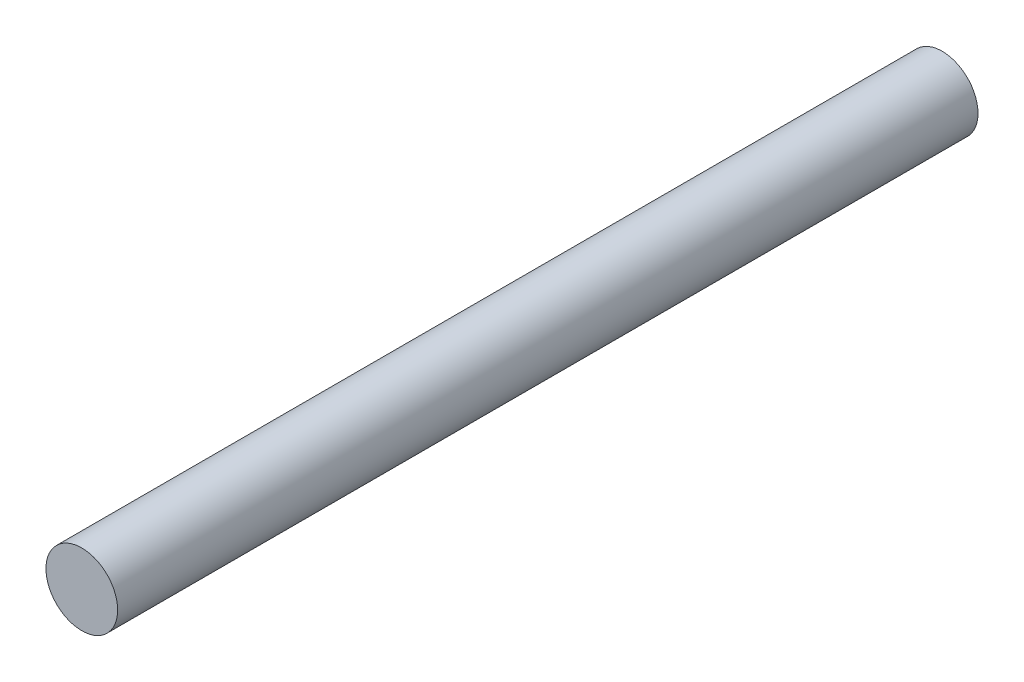
ISO-10303-21;
HEADER;
FILE_DESCRIPTION(('STEP AP214'),'2;1');
FILE_NAME('part.step','',(''),(''),'','','');
FILE_SCHEMA(('AUTOMOTIVE_DESIGN { 1 0 10303 214 1 1 1 1 }'));
ENDSEC;
DATA;
#1=APPLICATION_CONTEXT('core data for automotive mechanical design processes');
#2=APPLICATION_PROTOCOL_DEFINITION('international standard','automotive_design',2000,#1);
#3=PRODUCT_CONTEXT('',#1,'mechanical');
#4=PRODUCT('Part','Part','',(#3));
#5=PRODUCT_RELATED_PRODUCT_CATEGORY('part','',(#4));
#6=PRODUCT_DEFINITION_FORMATION('','',#4);
#7=PRODUCT_DEFINITION_CONTEXT('part definition',#1,'design');
#8=PRODUCT_DEFINITION('design','',#6,#7);
#9=PRODUCT_DEFINITION_SHAPE('','',#8);
#10=(LENGTH_UNIT() NAMED_UNIT(*) SI_UNIT(.MILLI.,.METRE.));
#11=(NAMED_UNIT(*) PLANE_ANGLE_UNIT() SI_UNIT($,.RADIAN.));
#12=(NAMED_UNIT(*) SI_UNIT($,.STERADIAN.) SOLID_ANGLE_UNIT());
#13=UNCERTAINTY_MEASURE_WITH_UNIT(LENGTH_MEASURE(1.E-05),#10,'distance_accuracy_value','');
#14=(GEOMETRIC_REPRESENTATION_CONTEXT(3) GLOBAL_UNCERTAINTY_ASSIGNED_CONTEXT((#13)) GLOBAL_UNIT_ASSIGNED_CONTEXT((#10,
#11,#12)) REPRESENTATION_CONTEXT('',''));
#15=CARTESIAN_POINT('',(0.,0.,0.));
#16=DIRECTION('',(0.,0.,1.));
#17=DIRECTION('',(1.,0.,0.));
#18=AXIS2_PLACEMENT_3D('',#15,#16,#17);
#19=CARTESIAN_POINT('',(0.,0.,60.));
#20=DIRECTION('',(0.,0.,-1.));
#21=DIRECTION('',(-1.,0.,0.));
#22=AXIS2_PLACEMENT_3D('',#19,#20,#21);
#23=CYLINDRICAL_SURFACE('',#22,2.5);
#24=CARTESIAN_POINT('',(0.,0.,60.));
#25=DIRECTION('',(0.,0.,1.));
#26=DIRECTION('',(1.,0.,0.));
#27=AXIS2_PLACEMENT_3D('',#24,#25,#26);
#28=CIRCLE('',#27,2.5);
#29=CARTESIAN_POINT('',(2.5,0.,60.));
#30=VERTEX_POINT('',#29);
#31=EDGE_CURVE('E10',#30,#30,#28,.T.);
#32=ORIENTED_EDGE('',*,*,#31,.F.);
#33=EDGE_LOOP('',(#32));
#34=FACE_BOUND('',#33,.T.);
#35=CARTESIAN_POINT('',(0.,0.,0.));
#36=DIRECTION('',(0.,0.,1.));
#37=DIRECTION('',(1.,0.,0.));
#38=AXIS2_PLACEMENT_3D('',#35,#36,#37);
#39=CIRCLE('',#38,2.5);
#40=CARTESIAN_POINT('',(2.5,0.,0.));
#41=VERTEX_POINT('',#40);
#42=EDGE_CURVE('E33',#41,#41,#39,.T.);
#43=ORIENTED_EDGE('',*,*,#42,.T.);
#44=EDGE_LOOP('',(#43));
#45=FACE_BOUND('',#44,.T.);
#46=ADVANCED_FACE('F30',(#34,#45),#23,.T.);
#47=CARTESIAN_POINT('',(0.,0.,60.));
#48=DIRECTION('',(0.,0.,1.));
#49=DIRECTION('',(1.,0.,0.));
#50=AXIS2_PLACEMENT_3D('',#47,#48,#49);
#51=PLANE('',#50);
#52=ORIENTED_EDGE('',*,*,#31,.T.);
#53=EDGE_LOOP('',(#52));
#54=FACE_BOUND('',#53,.T.);
#55=ADVANCED_FACE('F45',(#54),#51,.T.);
#56=CARTESIAN_POINT('',(0.,0.,0.));
#57=DIRECTION('',(0.,0.,1.));
#58=DIRECTION('',(1.,0.,0.));
#59=AXIS2_PLACEMENT_3D('',#56,#57,#58);
#60=PLANE('',#59);
#61=ORIENTED_EDGE('',*,*,#42,.F.);
#62=EDGE_LOOP('',(#61));
#63=FACE_BOUND('',#62,.T.);
#64=ADVANCED_FACE('F43',(#63),#60,.F.);
#65=CLOSED_SHELL('',(#46,#55,#64));
#66=MANIFOLD_SOLID_BREP('B2',#65);
#67=ADVANCED_BREP_SHAPE_REPRESENTATION('',(#18,#66),#14);
#68=SHAPE_DEFINITION_REPRESENTATION(#9,#67);
ENDSEC;
END-ISO-10303-21;
